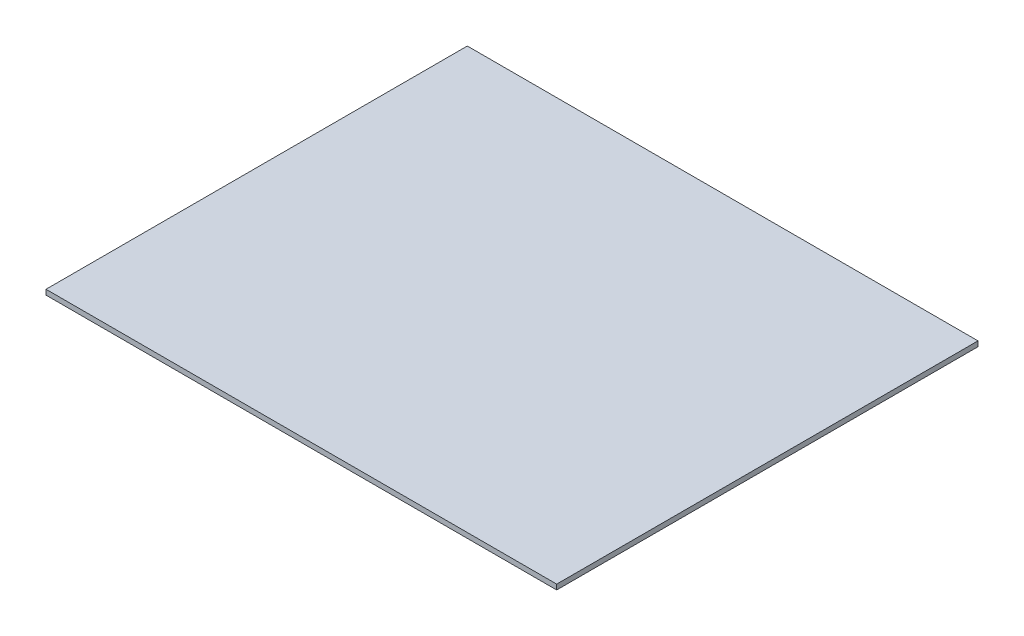
ISO-10303-21;
HEADER;
FILE_DESCRIPTION(('STEP AP214'),'2;1');
FILE_NAME('part.step','',(''),(''),'','','');
FILE_SCHEMA(('AUTOMOTIVE_DESIGN { 1 0 10303 214 1 1 1 1 }'));
ENDSEC;
DATA;
#1=APPLICATION_CONTEXT('core data for automotive mechanical design processes');
#2=APPLICATION_PROTOCOL_DEFINITION('international standard','automotive_design',2000,#1);
#3=PRODUCT_CONTEXT('',#1,'mechanical');
#4=PRODUCT('Part','Part','',(#3));
#5=PRODUCT_RELATED_PRODUCT_CATEGORY('part','',(#4));
#6=PRODUCT_DEFINITION_FORMATION('','',#4);
#7=PRODUCT_DEFINITION_CONTEXT('part definition',#1,'design');
#8=PRODUCT_DEFINITION('design','',#6,#7);
#9=PRODUCT_DEFINITION_SHAPE('','',#8);
#10=(LENGTH_UNIT() NAMED_UNIT(*) SI_UNIT(.MILLI.,.METRE.));
#11=(NAMED_UNIT(*) PLANE_ANGLE_UNIT() SI_UNIT($,.RADIAN.));
#12=(NAMED_UNIT(*) SI_UNIT($,.STERADIAN.) SOLID_ANGLE_UNIT());
#13=UNCERTAINTY_MEASURE_WITH_UNIT(LENGTH_MEASURE(1.E-05),#10,'distance_accuracy_value','');
#14=(GEOMETRIC_REPRESENTATION_CONTEXT(3) GLOBAL_UNCERTAINTY_ASSIGNED_CONTEXT((#13)) GLOBAL_UNIT_ASSIGNED_CONTEXT((#10,
#11,#12)) REPRESENTATION_CONTEXT('',''));
#15=CARTESIAN_POINT('',(0.,0.,0.));
#16=DIRECTION('',(0.,0.,1.));
#17=DIRECTION('',(1.,0.,0.));
#18=AXIS2_PLACEMENT_3D('',#15,#16,#17);
#19=CARTESIAN_POINT('',(-200.,4.,-165.));
#20=DIRECTION('',(1.,0.,0.));
#21=DIRECTION('',(0.,0.,-1.));
#22=AXIS2_PLACEMENT_3D('',#19,#20,#21);
#23=PLANE('',#22);
#24=DIRECTION('',(0.,0.,1.));
#25=VECTOR('',#24,1.);
#26=CARTESIAN_POINT('',(-200.,0.,-165.));
#27=LINE('',#26,#25);
#28=CARTESIAN_POINT('',(-200.,0.,-165.));
#29=VERTEX_POINT('',#28);
#30=CARTESIAN_POINT('',(-200.,0.,165.));
#31=VERTEX_POINT('',#30);
#32=EDGE_CURVE('E98',#29,#31,#27,.T.);
#33=ORIENTED_EDGE('',*,*,#32,.T.);
#34=DIRECTION('',(0.,-1.,0.));
#35=VECTOR('',#34,1.);
#36=CARTESIAN_POINT('',(-200.,4.,165.));
#37=LINE('',#36,#35);
#38=CARTESIAN_POINT('',(-200.,4.,165.));
#39=VERTEX_POINT('',#38);
#40=EDGE_CURVE('E11',#39,#31,#37,.T.);
#41=ORIENTED_EDGE('',*,*,#40,.F.);
#42=DIRECTION('',(0.,0.,1.));
#43=VECTOR('',#42,1.);
#44=CARTESIAN_POINT('',(-200.,4.,-165.));
#45=LINE('',#44,#43);
#46=CARTESIAN_POINT('',(-200.,4.,-165.));
#47=VERTEX_POINT('',#46);
#48=EDGE_CURVE('E86',#47,#39,#45,.T.);
#49=ORIENTED_EDGE('',*,*,#48,.F.);
#50=DIRECTION('',(0.,-1.,0.));
#51=VECTOR('',#50,1.);
#52=CARTESIAN_POINT('',(-200.,4.,-165.));
#53=LINE('',#52,#51);
#54=EDGE_CURVE('E94',#47,#29,#53,.T.);
#55=ORIENTED_EDGE('',*,*,#54,.T.);
#56=EDGE_LOOP('',(#33,#41,#49,#55));
#57=FACE_BOUND('',#56,.T.);
#58=ADVANCED_FACE('F35',(#57),#23,.F.);
#59=CARTESIAN_POINT('',(200.,4.,165.));
#60=DIRECTION('',(0.,0.,-1.));
#61=DIRECTION('',(-1.,0.,0.));
#62=AXIS2_PLACEMENT_3D('',#59,#60,#61);
#63=PLANE('',#62);
#64=DIRECTION('',(1.,0.,0.));
#65=VECTOR('',#64,1.);
#66=CARTESIAN_POINT('',(200.,0.,165.));
#67=LINE('',#66,#65);
#68=CARTESIAN_POINT('',(200.,0.,165.));
#69=VERTEX_POINT('',#68);
#70=EDGE_CURVE('E90',#31,#69,#67,.T.);
#71=ORIENTED_EDGE('',*,*,#70,.T.);
#72=DIRECTION('',(0.,-1.,0.));
#73=VECTOR('',#72,1.);
#74=CARTESIAN_POINT('',(200.,4.,165.));
#75=LINE('',#74,#73);
#76=CARTESIAN_POINT('',(200.,4.,165.));
#77=VERTEX_POINT('',#76);
#78=EDGE_CURVE('E43',#77,#69,#75,.T.);
#79=ORIENTED_EDGE('',*,*,#78,.F.);
#80=DIRECTION('',(1.,0.,0.));
#81=VECTOR('',#80,1.);
#82=CARTESIAN_POINT('',(200.,4.,165.));
#83=LINE('',#82,#81);
#84=EDGE_CURVE('E81',#39,#77,#83,.T.);
#85=ORIENTED_EDGE('',*,*,#84,.F.);
#86=ORIENTED_EDGE('',*,*,#40,.T.);
#87=EDGE_LOOP('',(#71,#79,#85,#86));
#88=FACE_BOUND('',#87,.T.);
#89=ADVANCED_FACE('F89',(#88),#63,.F.);
#90=CARTESIAN_POINT('',(200.,4.,-165.));
#91=DIRECTION('',(-1.,0.,0.));
#92=DIRECTION('',(0.,0.,1.));
#93=AXIS2_PLACEMENT_3D('',#90,#91,#92);
#94=PLANE('',#93);
#95=DIRECTION('',(0.,0.,-1.));
#96=VECTOR('',#95,1.);
#97=CARTESIAN_POINT('',(200.,0.,-165.));
#98=LINE('',#97,#96);
#99=CARTESIAN_POINT('',(200.,0.,-165.));
#100=VERTEX_POINT('',#99);
#101=EDGE_CURVE('E68',#69,#100,#98,.T.);
#102=ORIENTED_EDGE('',*,*,#101,.T.);
#103=DIRECTION('',(0.,-1.,0.));
#104=VECTOR('',#103,1.);
#105=CARTESIAN_POINT('',(200.,4.,-165.));
#106=LINE('',#105,#104);
#107=CARTESIAN_POINT('',(200.,4.,-165.));
#108=VERTEX_POINT('',#107);
#109=EDGE_CURVE('E91',#108,#100,#106,.T.);
#110=ORIENTED_EDGE('',*,*,#109,.F.);
#111=DIRECTION('',(0.,0.,-1.));
#112=VECTOR('',#111,1.);
#113=CARTESIAN_POINT('',(200.,4.,-165.));
#114=LINE('',#113,#112);
#115=EDGE_CURVE('E84',#77,#108,#114,.T.);
#116=ORIENTED_EDGE('',*,*,#115,.F.);
#117=ORIENTED_EDGE('',*,*,#78,.T.);
#118=EDGE_LOOP('',(#102,#110,#116,#117));
#119=FACE_BOUND('',#118,.T.);
#120=ADVANCED_FACE('F92',(#119),#94,.F.);
#121=CARTESIAN_POINT('',(200.,4.,-165.));
#122=DIRECTION('',(0.,0.,1.));
#123=DIRECTION('',(1.,0.,0.));
#124=AXIS2_PLACEMENT_3D('',#121,#122,#123);
#125=PLANE('',#124);
#126=DIRECTION('',(-1.,0.,0.));
#127=VECTOR('',#126,1.);
#128=CARTESIAN_POINT('',(200.,0.,-165.));
#129=LINE('',#128,#127);
#130=EDGE_CURVE('E74',#100,#29,#129,.T.);
#131=ORIENTED_EDGE('',*,*,#130,.T.);
#132=ORIENTED_EDGE('',*,*,#54,.F.);
#133=DIRECTION('',(-1.,0.,0.));
#134=VECTOR('',#133,1.);
#135=CARTESIAN_POINT('',(200.,4.,-165.));
#136=LINE('',#135,#134);
#137=EDGE_CURVE('E51',#108,#47,#136,.T.);
#138=ORIENTED_EDGE('',*,*,#137,.F.);
#139=ORIENTED_EDGE('',*,*,#109,.T.);
#140=EDGE_LOOP('',(#131,#132,#138,#139));
#141=FACE_BOUND('',#140,.T.);
#142=ADVANCED_FACE('F105',(#141),#125,.F.);
#143=CARTESIAN_POINT('',(0.,4.,0.));
#144=DIRECTION('',(0.,-1.,0.));
#145=DIRECTION('',(0.,0.,-1.));
#146=AXIS2_PLACEMENT_3D('',#143,#144,#145);
#147=PLANE('',#146);
#148=ORIENTED_EDGE('',*,*,#48,.T.);
#149=ORIENTED_EDGE('',*,*,#84,.T.);
#150=ORIENTED_EDGE('',*,*,#115,.T.);
#151=ORIENTED_EDGE('',*,*,#137,.T.);
#152=EDGE_LOOP('',(#148,#149,#150,#151));
#153=FACE_BOUND('',#152,.T.);
#154=ADVANCED_FACE('F82',(#153),#147,.F.);
#155=CARTESIAN_POINT('',(0.,0.,0.));
#156=DIRECTION('',(0.,-1.,0.));
#157=DIRECTION('',(0.,0.,-1.));
#158=AXIS2_PLACEMENT_3D('',#155,#156,#157);
#159=PLANE('',#158);
#160=ORIENTED_EDGE('',*,*,#32,.F.);
#161=ORIENTED_EDGE('',*,*,#130,.F.);
#162=ORIENTED_EDGE('',*,*,#101,.F.);
#163=ORIENTED_EDGE('',*,*,#70,.F.);
#164=EDGE_LOOP('',(#160,#161,#162,#163));
#165=FACE_BOUND('',#164,.T.);
#166=ADVANCED_FACE('F108',(#165),#159,.T.);
#167=CLOSED_SHELL('',(#58,#89,#120,#142,#154,#166));
#168=MANIFOLD_SOLID_BREP('B2',#167);
#169=ADVANCED_BREP_SHAPE_REPRESENTATION('',(#18,#168),#14);
#170=SHAPE_DEFINITION_REPRESENTATION(#9,#169);
ENDSEC;
END-ISO-10303-21;
